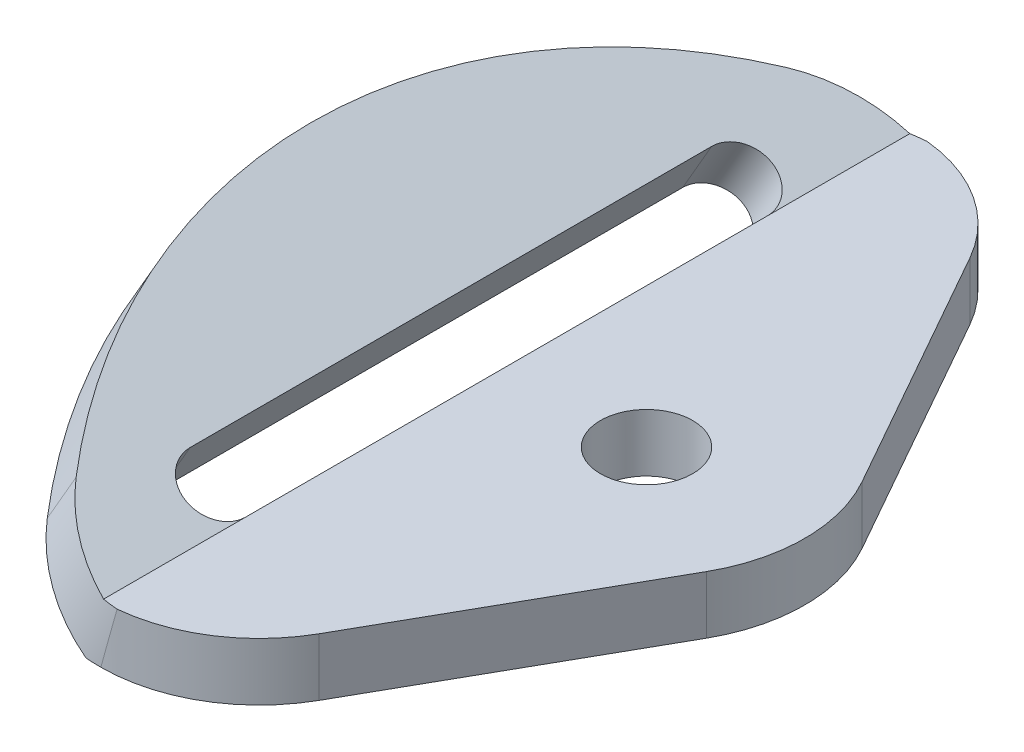
ISO-10303-21;
HEADER;
FILE_DESCRIPTION(('STEP AP214'),'2;1');
FILE_NAME('part.step','',(''),(''),'','','');
FILE_SCHEMA(('AUTOMOTIVE_DESIGN { 1 0 10303 214 1 1 1 1 }'));
ENDSEC;
DATA;
#1=APPLICATION_CONTEXT('core data for automotive mechanical design processes');
#2=APPLICATION_PROTOCOL_DEFINITION('international standard','automotive_design',2000,#1);
#3=PRODUCT_CONTEXT('',#1,'mechanical');
#4=PRODUCT('Part','Part','',(#3));
#5=PRODUCT_RELATED_PRODUCT_CATEGORY('part','',(#4));
#6=PRODUCT_DEFINITION_FORMATION('','',#4);
#7=PRODUCT_DEFINITION_CONTEXT('part definition',#1,'design');
#8=PRODUCT_DEFINITION('design','',#6,#7);
#9=PRODUCT_DEFINITION_SHAPE('','',#8);
#10=(LENGTH_UNIT() NAMED_UNIT(*) SI_UNIT(.MILLI.,.METRE.));
#11=(NAMED_UNIT(*) PLANE_ANGLE_UNIT() SI_UNIT($,.RADIAN.));
#12=(NAMED_UNIT(*) SI_UNIT($,.STERADIAN.) SOLID_ANGLE_UNIT());
#13=UNCERTAINTY_MEASURE_WITH_UNIT(LENGTH_MEASURE(1.E-05),#10,'distance_accuracy_value','');
#14=(GEOMETRIC_REPRESENTATION_CONTEXT(3) GLOBAL_UNCERTAINTY_ASSIGNED_CONTEXT((#13)) GLOBAL_UNIT_ASSIGNED_CONTEXT((#10,
#11,#12)) REPRESENTATION_CONTEXT('',''));
#15=CARTESIAN_POINT('',(0.,0.,0.));
#16=DIRECTION('',(0.,0.,1.));
#17=DIRECTION('',(1.,0.,0.));
#18=AXIS2_PLACEMENT_3D('',#15,#16,#17);
#19=CARTESIAN_POINT('',(0.,0.,35.179));
#20=DIRECTION('',(0.499999999999995,0.866025403784442,0.));
#21=DIRECTION('',(-0.866025403784442,0.499999999999995,0.));
#22=AXIS2_PLACEMENT_3D('',#19,#20,#21);
#23=PLANE('',#22);
#24=DIRECTION('',(0.,0.,-1.));
#25=VECTOR('',#24,1.);
#26=CARTESIAN_POINT('',(-6.00048578726058,3.46438208454337,22.606));
#27=LINE('',#26,#25);
#28=CARTESIAN_POINT('',(-6.00048578726058,3.46438208454337,22.606));
#29=VERTEX_POINT('',#28);
#30=CARTESIAN_POINT('',(-6.00048578726058,3.46438208454337,-22.606));
#31=VERTEX_POINT('',#30);
#32=EDGE_CURVE('E197',#29,#31,#27,.T.);
#33=ORIENTED_EDGE('',*,*,#32,.F.);
#34=CARTESIAN_POINT('',(-3.58081080908685,2.06738208454339,22.606));
#35=DIRECTION('',(-0.499999999999995,-0.866025403784442,0.));
#36=DIRECTION('',(0.866025403784442,-0.499999999999995,0.));
#37=AXIS2_PLACEMENT_3D('',#34,#35,#36);
#38=CIRCLE('',#37,2.794);
#39=CARTESIAN_POINT('',(-1.16113583091312,0.670382084543401,22.606));
#40=VERTEX_POINT('',#39);
#41=EDGE_CURVE('E62',#40,#29,#38,.T.);
#42=ORIENTED_EDGE('',*,*,#41,.F.);
#43=DIRECTION('',(0.,0.,1.));
#44=VECTOR('',#43,1.);
#45=CARTESIAN_POINT('',(-1.16113583091312,0.670382084543401,22.606));
#46=LINE('',#45,#44);
#47=CARTESIAN_POINT('',(-1.16113583091312,0.670382084543401,-22.606));
#48=VERTEX_POINT('',#47);
#49=EDGE_CURVE('E205',#48,#40,#46,.T.);
#50=ORIENTED_EDGE('',*,*,#49,.F.);
#51=CARTESIAN_POINT('',(-3.58081080908685,2.06738208454339,-22.606));
#52=DIRECTION('',(-0.499999999999995,-0.866025403784442,0.));
#53=DIRECTION('',(0.866025403784442,-0.499999999999995,0.));
#54=AXIS2_PLACEMENT_3D('',#51,#52,#53);
#55=CIRCLE('',#54,2.794);
#56=EDGE_CURVE('E201',#31,#48,#55,.T.);
#57=ORIENTED_EDGE('',*,*,#56,.F.);
#58=EDGE_LOOP('',(#33,#42,#50,#57));
#59=FACE_BOUND('',#58,.T.);
#60=CARTESIAN_POINT('',(1.00557312681514,-0.580567915456566,21.463));
#61=DIRECTION('',(0.499999999999995,0.866025403784442,0.));
#62=DIRECTION('',(0.866025403784442,-0.499999999999995,0.));
#63=AXIS2_PLACEMENT_3D('',#60,#61,#62);
#64=CIRCLE('',#63,13.716);
#65=CARTESIAN_POINT('',(-7.71721540588537,4.45553639198218,30.7731702249951));
#66=VERTEX_POINT('',#65);
#67=CARTESIAN_POINT('',(0.,0.,35.1297633177051));
#68=VERTEX_POINT('',#67);
#69=EDGE_CURVE('E139',#66,#68,#64,.T.);
#70=ORIENTED_EDGE('',*,*,#69,.F.);
#71=CARTESIAN_POINT('',(21.1144654191093,-12.1904422935176,0.));
#72=DIRECTION('',(0.499999999999995,0.866025403784442,0.));
#73=DIRECTION('',(0.866025403784442,-0.499999999999995,0.));
#74=AXIS2_PLACEMENT_3D('',#71,#72,#73);
#75=CIRCLE('',#74,45.3358845870355);
#76=CARTESIAN_POINT('',(-7.71721540588537,4.45553639198218,-30.7731702249951));
#77=VERTEX_POINT('',#76);
#78=EDGE_CURVE('E167',#77,#66,#75,.T.);
#79=ORIENTED_EDGE('',*,*,#78,.F.);
#80=CARTESIAN_POINT('',(1.00557312681514,-0.580567915456566,-21.463));
#81=DIRECTION('',(0.499999999999995,0.866025403784442,0.));
#82=DIRECTION('',(0.866025403784442,-0.499999999999995,0.));
#83=AXIS2_PLACEMENT_3D('',#80,#81,#82);
#84=CIRCLE('',#83,13.716);
#85=CARTESIAN_POINT('',(0.,0.,-35.1297633177051));
#86=VERTEX_POINT('',#85);
#87=EDGE_CURVE('E166',#86,#77,#84,.T.);
#88=ORIENTED_EDGE('',*,*,#87,.F.);
#89=DIRECTION('',(0.,0.,-1.));
#90=VECTOR('',#89,1.);
#91=CARTESIAN_POINT('',(0.,0.,35.179));
#92=LINE('',#91,#90);
#93=EDGE_CURVE('E11',#68,#86,#92,.T.);
#94=ORIENTED_EDGE('',*,*,#93,.F.);
#95=EDGE_LOOP('',(#70,#79,#88,#94));
#96=FACE_BOUND('',#95,.T.);
#97=ADVANCED_FACE('F39',(#59,#96),#23,.F.);
#98=CARTESIAN_POINT('',(0.,0.,35.179));
#99=DIRECTION('',(0.,1.,0.));
#100=DIRECTION('',(0.,0.,1.));
#101=AXIS2_PLACEMENT_3D('',#98,#99,#100);
#102=PLANE('',#101);
#103=CARTESIAN_POINT('',(13.462,0.,0.));
#104=DIRECTION('',(0.,-1.,0.));
#105=DIRECTION('',(0.,0.,-1.));
#106=AXIS2_PLACEMENT_3D('',#103,#104,#105);
#107=CIRCLE('',#106,4.);
#108=CARTESIAN_POINT('',(13.462,0.,-4.));
#109=VERTEX_POINT('',#108);
#110=EDGE_CURVE('E272',#109,#109,#107,.T.);
#111=ORIENTED_EDGE('',*,*,#110,.F.);
#112=EDGE_LOOP('',(#111));
#113=FACE_BOUND('',#112,.T.);
#114=CARTESIAN_POINT('',(1.34076416908684,0.,21.463));
#115=DIRECTION('',(0.,1.,0.));
#116=DIRECTION('',(0.,0.,-1.));
#117=AXIS2_PLACEMENT_3D('',#114,#115,#116);
#118=CIRCLE('',#117,13.716);
#119=CARTESIAN_POINT('',(1.34076416908683,0.,35.179));
#120=VERTEX_POINT('',#119);
#121=CARTESIAN_POINT('',(13.2837929201756,0.,28.2078291491088));
#122=VERTEX_POINT('',#121);
#123=EDGE_CURVE('E160',#120,#122,#118,.T.);
#124=ORIENTED_EDGE('',*,*,#123,.F.);
#125=CARTESIAN_POINT('',(1.34076416908684,0.,21.463));
#126=DIRECTION('',(0.,1.,0.));
#127=DIRECTION('',(-1.,0.,0.));
#128=AXIS2_PLACEMENT_3D('',#125,#126,#127);
#129=ELLIPSE('',#128,15.8378725844098,13.716);
#130=EDGE_CURVE('E143',#68,#120,#129,.T.);
#131=ORIENTED_EDGE('',*,*,#130,.F.);
#132=ORIENTED_EDGE('',*,*,#93,.T.);
#133=CARTESIAN_POINT('',(1.34076416908684,0.,-21.463));
#134=DIRECTION('',(0.,1.,0.));
#135=DIRECTION('',(-1.,0.,0.));
#136=AXIS2_PLACEMENT_3D('',#133,#134,#135);
#137=ELLIPSE('',#136,15.8378725844098,13.716);
#138=CARTESIAN_POINT('',(1.34076416908684,0.,-35.179));
#139=VERTEX_POINT('',#138);
#140=EDGE_CURVE('E162',#139,#86,#137,.T.);
#141=ORIENTED_EDGE('',*,*,#140,.F.);
#142=CARTESIAN_POINT('',(1.34076416908684,0.,-21.463));
#143=DIRECTION('',(0.,1.,0.));
#144=DIRECTION('',(0.,0.,-1.));
#145=AXIS2_PLACEMENT_3D('',#142,#143,#144);
#146=CIRCLE('',#145,13.716);
#147=CARTESIAN_POINT('',(13.2837929201756,0.,-28.2078291491088));
#148=VERTEX_POINT('',#147);
#149=EDGE_CURVE('E256',#148,#139,#146,.T.);
#150=ORIENTED_EDGE('',*,*,#149,.F.);
#151=DIRECTION('',(-0.491748990165414,0.,-0.870737004308014));
#152=VECTOR('',#151,1.);
#153=CARTESIAN_POINT('',(13.2837929201756,0.,-28.2078291491088));
#154=LINE('',#153,#152);
#155=CARTESIAN_POINT('',(25.4050287510887,0.,-6.74482914910882));
#156=VERTEX_POINT('',#155);
#157=EDGE_CURVE('E264',#156,#148,#154,.T.);
#158=ORIENTED_EDGE('',*,*,#157,.F.);
#159=CARTESIAN_POINT('',(13.462,0.,0.));
#160=DIRECTION('',(0.,1.,0.));
#161=DIRECTION('',(0.,0.,-1.));
#162=AXIS2_PLACEMENT_3D('',#159,#160,#161);
#163=CIRCLE('',#162,13.716);
#164=CARTESIAN_POINT('',(25.4050287510887,0.,6.74482914910882));
#165=VERTEX_POINT('',#164);
#166=EDGE_CURVE('E260',#165,#156,#163,.T.);
#167=ORIENTED_EDGE('',*,*,#166,.F.);
#168=DIRECTION('',(0.491748990165414,0.,-0.870737004308014));
#169=VECTOR('',#168,1.);
#170=CARTESIAN_POINT('',(13.2837929201756,0.,28.2078291491088));
#171=LINE('',#170,#169);
#172=EDGE_CURVE('E236',#122,#165,#171,.T.);
#173=ORIENTED_EDGE('',*,*,#172,.F.);
#174=EDGE_LOOP('',(#124,#131,#132,#141,#150,#158,#167,#173));
#175=FACE_BOUND('',#174,.T.);
#176=ADVANCED_FACE('F155',(#113,#175),#102,.F.);
#177=CARTESIAN_POINT('',(27.178,5.0038,35.179));
#178=DIRECTION('',(0.,-1.,0.));
#179=DIRECTION('',(1.,0.,0.));
#180=AXIS2_PLACEMENT_3D('',#177,#178,#179);
#181=PLANE('',#180);
#182=CARTESIAN_POINT('',(13.462,5.0038,0.));
#183=DIRECTION('',(0.,-1.,0.));
#184=DIRECTION('',(1.,0.,0.));
#185=AXIS2_PLACEMENT_3D('',#182,#183,#184);
#186=CIRCLE('',#185,4.);
#187=CARTESIAN_POINT('',(17.462,5.0038,0.));
#188=VERTEX_POINT('',#187);
#189=EDGE_CURVE('E278',#188,#188,#186,.F.);
#190=ORIENTED_EDGE('',*,*,#189,.F.);
#191=EDGE_LOOP('',(#190));
#192=FACE_BOUND('',#191,.T.);
#193=DIRECTION('',(0.,0.,-1.));
#194=VECTOR('',#193,1.);
#195=CARTESIAN_POINT('',(1.34076416908684,5.0038,35.179));
#196=LINE('',#195,#194);
#197=CARTESIAN_POINT('',(1.34076416908684,5.0038,34.9488871562089));
#198=VERTEX_POINT('',#197);
#199=CARTESIAN_POINT('',(1.34076416908685,5.00379999999998,22.606));
#200=VERTEX_POINT('',#199);
#201=EDGE_CURVE('E47',#198,#200,#196,.T.);
#202=ORIENTED_EDGE('',*,*,#201,.F.);
#203=CARTESIAN_POINT('',(4.22970944605785,5.00379999999999,21.463));
#204=DIRECTION('',(0.,-1.,0.));
#205=DIRECTION('',(-1.,0.,0.));
#206=AXIS2_PLACEMENT_3D('',#203,#204,#205);
#207=ELLIPSE('',#206,15.8378725844098,13.716);
#208=CARTESIAN_POINT('',(2.68152833817368,5.0038,35.1133116243877));
#209=VERTEX_POINT('',#208);
#210=EDGE_CURVE('E151',#209,#198,#207,.T.);
#211=ORIENTED_EDGE('',*,*,#210,.F.);
#212=CARTESIAN_POINT('',(1.34076416908684,5.0038,21.463));
#213=DIRECTION('',(0.,-1.,0.));
#214=DIRECTION('',(1.,0.,0.));
#215=AXIS2_PLACEMENT_3D('',#212,#213,#214);
#216=CIRCLE('',#215,13.716);
#217=CARTESIAN_POINT('',(13.2837929201756,5.0038,28.2078291491088));
#218=VERTEX_POINT('',#217);
#219=EDGE_CURVE('E226',#218,#209,#216,.T.);
#220=ORIENTED_EDGE('',*,*,#219,.F.);
#221=DIRECTION('',(-0.491748990165414,0.,0.870737004308015));
#222=VECTOR('',#221,1.);
#223=CARTESIAN_POINT('',(13.2837929201756,5.0038,28.2078291491088));
#224=LINE('',#223,#222);
#225=CARTESIAN_POINT('',(25.4050287510887,5.0038,6.74482914910882));
#226=VERTEX_POINT('',#225);
#227=EDGE_CURVE('E225',#226,#218,#224,.T.);
#228=ORIENTED_EDGE('',*,*,#227,.F.);
#229=CARTESIAN_POINT('',(13.462,5.0038,0.));
#230=DIRECTION('',(0.,-1.,0.));
#231=DIRECTION('',(1.,0.,0.));
#232=AXIS2_PLACEMENT_3D('',#229,#230,#231);
#233=CIRCLE('',#232,13.716);
#234=CARTESIAN_POINT('',(25.4050287510887,5.0038,-6.74482914910882));
#235=VERTEX_POINT('',#234);
#236=EDGE_CURVE('E241',#235,#226,#233,.T.);
#237=ORIENTED_EDGE('',*,*,#236,.F.);
#238=DIRECTION('',(0.491748990165414,0.,0.870737004308014));
#239=VECTOR('',#238,1.);
#240=CARTESIAN_POINT('',(13.2837929201756,5.0038,-28.2078291491088));
#241=LINE('',#240,#239);
#242=CARTESIAN_POINT('',(13.2837929201756,5.0038,-28.2078291491088));
#243=VERTEX_POINT('',#242);
#244=EDGE_CURVE('E249',#243,#235,#241,.T.);
#245=ORIENTED_EDGE('',*,*,#244,.F.);
#246=CARTESIAN_POINT('',(1.34076416908684,5.0038,-21.463));
#247=DIRECTION('',(0.,-1.,0.));
#248=DIRECTION('',(1.,0.,0.));
#249=AXIS2_PLACEMENT_3D('',#246,#247,#248);
#250=CIRCLE('',#249,13.716);
#251=CARTESIAN_POINT('',(2.68152833817368,5.0038,-35.1133116243877));
#252=VERTEX_POINT('',#251);
#253=EDGE_CURVE('E253',#252,#243,#250,.T.);
#254=ORIENTED_EDGE('',*,*,#253,.F.);
#255=CARTESIAN_POINT('',(4.22970944605785,5.00379999999999,-21.463));
#256=DIRECTION('',(0.,-1.,0.));
#257=DIRECTION('',(-1.,0.,0.));
#258=AXIS2_PLACEMENT_3D('',#255,#256,#257);
#259=ELLIPSE('',#258,15.8378725844098,13.716);
#260=CARTESIAN_POINT('',(1.34076416908684,5.0038,-34.9488871562089));
#261=VERTEX_POINT('',#260);
#262=EDGE_CURVE('E54',#261,#252,#259,.T.);
#263=ORIENTED_EDGE('',*,*,#262,.F.);
#264=CARTESIAN_POINT('',(1.34076416908685,5.00379999999999,-22.606));
#265=VERTEX_POINT('',#264);
#266=EDGE_CURVE('E281',#265,#261,#196,.T.);
#267=ORIENTED_EDGE('',*,*,#266,.F.);
#268=DIRECTION('',(0.,0.,-1.));
#269=VECTOR('',#268,1.);
#270=CARTESIAN_POINT('',(1.34076416908684,5.0038,35.179));
#271=LINE('',#270,#269);
#272=EDGE_CURVE('E184',#200,#265,#271,.T.);
#273=ORIENTED_EDGE('',*,*,#272,.F.);
#274=EDGE_LOOP('',(#202,#211,#220,#228,#237,#245,#254,#263,#267,#273));
#275=FACE_BOUND('',#274,.T.);
#276=ADVANCED_FACE('F298',(#192,#275),#181,.F.);
#277=CARTESIAN_POINT('',(-15.645662336303,14.8109179154565,35.179));
#278=DIRECTION('',(-0.499999999999995,-0.866025403784442,0.));
#279=DIRECTION('',(0.866025403784442,-0.499999999999995,0.));
#280=AXIS2_PLACEMENT_3D('',#277,#278,#279);
#281=PLANE('',#280);
#282=CARTESIAN_POINT('',(23.6163654191093,-7.85702437806106,0.));
#283=DIRECTION('',(-0.499999999999995,-0.866025403784442,0.));
#284=DIRECTION('',(0.866025403784442,-0.499999999999995,0.));
#285=AXIS2_PLACEMENT_3D('',#282,#283,#284);
#286=CIRCLE('',#285,45.3358845870355);
#287=CARTESIAN_POINT('',(-5.21531540588539,8.78895430743877,30.7731702249951));
#288=VERTEX_POINT('',#287);
#289=CARTESIAN_POINT('',(-5.2153154058854,8.78895430743877,-30.7731702249951));
#290=VERTEX_POINT('',#289);
#291=EDGE_CURVE('E180',#288,#290,#286,.T.);
#292=ORIENTED_EDGE('',*,*,#291,.F.);
#293=CARTESIAN_POINT('',(3.50747312681511,3.75285000000002,21.463));
#294=DIRECTION('',(-0.499999999999995,-0.866025403784442,0.));
#295=DIRECTION('',(0.866025403784442,-0.499999999999995,0.));
#296=AXIS2_PLACEMENT_3D('',#293,#294,#295);
#297=CIRCLE('',#296,13.716);
#298=EDGE_CURVE('E312',#198,#288,#297,.T.);
#299=ORIENTED_EDGE('',*,*,#298,.F.);
#300=ORIENTED_EDGE('',*,*,#201,.T.);
#301=CARTESIAN_POINT('',(-1.07891080908688,6.40079999999997,22.606));
#302=DIRECTION('',(-0.499999999999995,-0.866025403784442,0.));
#303=DIRECTION('',(0.866025403784442,-0.499999999999995,0.));
#304=AXIS2_PLACEMENT_3D('',#301,#302,#303);
#305=CIRCLE('',#304,2.794);
#306=CARTESIAN_POINT('',(-3.49858578726061,7.79779999999996,22.606));
#307=VERTEX_POINT('',#306);
#308=EDGE_CURVE('E191',#307,#200,#305,.F.);
#309=ORIENTED_EDGE('',*,*,#308,.F.);
#310=DIRECTION('',(0.,0.,1.));
#311=VECTOR('',#310,1.);
#312=CARTESIAN_POINT('',(-3.49858578726061,7.79779999999996,22.606));
#313=LINE('',#312,#311);
#314=CARTESIAN_POINT('',(-3.49858578726061,7.79779999999996,-22.606));
#315=VERTEX_POINT('',#314);
#316=EDGE_CURVE('E213',#315,#307,#313,.T.);
#317=ORIENTED_EDGE('',*,*,#316,.F.);
#318=CARTESIAN_POINT('',(-1.07891080908688,6.40079999999997,-22.606));
#319=DIRECTION('',(-0.499999999999995,-0.866025403784442,0.));
#320=DIRECTION('',(0.866025403784442,-0.499999999999995,0.));
#321=AXIS2_PLACEMENT_3D('',#318,#319,#320);
#322=CIRCLE('',#321,2.794);
#323=EDGE_CURVE('E188',#265,#315,#322,.F.);
#324=ORIENTED_EDGE('',*,*,#323,.F.);
#325=ORIENTED_EDGE('',*,*,#266,.T.);
#326=CARTESIAN_POINT('',(3.50747312681511,3.75285000000002,-21.463));
#327=DIRECTION('',(-0.499999999999995,-0.866025403784442,0.));
#328=DIRECTION('',(0.866025403784442,-0.499999999999995,0.));
#329=AXIS2_PLACEMENT_3D('',#326,#327,#328);
#330=CIRCLE('',#329,13.716);
#331=EDGE_CURVE('E294',#290,#261,#330,.T.);
#332=ORIENTED_EDGE('',*,*,#331,.F.);
#333=EDGE_LOOP('',(#292,#299,#300,#309,#317,#324,#325,#332));
#334=FACE_BOUND('',#333,.T.);
#335=ADVANCED_FACE('F293',(#334),#281,.F.);
#336=CARTESIAN_POINT('',(13.462,14.8119179154565,0.));
#337=DIRECTION('',(0.,-1.,0.));
#338=DIRECTION('',(0.,0.,-1.));
#339=AXIS2_PLACEMENT_3D('',#336,#337,#338);
#340=CYLINDRICAL_SURFACE('',#339,4.);
#341=ORIENTED_EDGE('',*,*,#110,.T.);
#342=EDGE_LOOP('',(#341));
#343=FACE_BOUND('',#342,.T.);
#344=ORIENTED_EDGE('',*,*,#189,.T.);
#345=EDGE_LOOP('',(#344));
#346=FACE_BOUND('',#345,.T.);
#347=ADVANCED_FACE('F379',(#343,#346),#340,.F.);
#348=CARTESIAN_POINT('',(13.462,14.8119179154565,0.));
#349=DIRECTION('',(0.,-1.,0.));
#350=DIRECTION('',(0.,0.,-1.));
#351=AXIS2_PLACEMENT_3D('',#348,#349,#350);
#352=CYLINDRICAL_SURFACE('',#351,13.716);
#353=ORIENTED_EDGE('',*,*,#236,.T.);
#354=DIRECTION('',(0.,-1.,0.));
#355=VECTOR('',#354,1.);
#356=CARTESIAN_POINT('',(25.4050287510887,14.8119179154565,6.74482914910882));
#357=LINE('',#356,#355);
#358=EDGE_CURVE('E230',#226,#165,#357,.T.);
#359=ORIENTED_EDGE('',*,*,#358,.T.);
#360=ORIENTED_EDGE('',*,*,#166,.T.);
#361=DIRECTION('',(0.,-1.,0.));
#362=VECTOR('',#361,1.);
#363=CARTESIAN_POINT('',(25.4050287510887,14.8119179154565,-6.74482914910882));
#364=LINE('',#363,#362);
#365=EDGE_CURVE('E268',#235,#156,#364,.T.);
#366=ORIENTED_EDGE('',*,*,#365,.F.);
#367=EDGE_LOOP('',(#353,#359,#360,#366));
#368=FACE_BOUND('',#367,.T.);
#369=ADVANCED_FACE('F326',(#368),#352,.T.);
#370=CARTESIAN_POINT('',(13.2837929201756,14.8119179154565,-28.2078291491088));
#371=DIRECTION('',(-0.870737004308014,0.,0.491748990165414));
#372=DIRECTION('',(0.491748990165414,0.,0.870737004308014));
#373=AXIS2_PLACEMENT_3D('',#370,#371,#372);
#374=PLANE('',#373);
#375=ORIENTED_EDGE('',*,*,#244,.T.);
#376=ORIENTED_EDGE('',*,*,#365,.T.);
#377=ORIENTED_EDGE('',*,*,#157,.T.);
#378=DIRECTION('',(0.,-1.,0.));
#379=VECTOR('',#378,1.);
#380=CARTESIAN_POINT('',(13.2837929201756,14.8119179154565,-28.2078291491088));
#381=LINE('',#380,#379);
#382=EDGE_CURVE('E269',#243,#148,#381,.T.);
#383=ORIENTED_EDGE('',*,*,#382,.F.);
#384=EDGE_LOOP('',(#375,#376,#377,#383));
#385=FACE_BOUND('',#384,.T.);
#386=ADVANCED_FACE('F330',(#385),#374,.F.);
#387=CARTESIAN_POINT('',(1.34076416908684,14.8119179154565,-21.463));
#388=DIRECTION('',(0.,-1.,0.));
#389=DIRECTION('',(0.,0.,-1.));
#390=AXIS2_PLACEMENT_3D('',#387,#388,#389);
#391=CYLINDRICAL_SURFACE('',#390,13.716);
#392=ORIENTED_EDGE('',*,*,#149,.T.);
#393=CARTESIAN_POINT('',(1.34076416908684,0.,-21.463));
#394=DIRECTION('',(-0.965925826289069,0.258819045102518,0.));
#395=DIRECTION('',(-0.258819045102518,-0.965925826289069,0.));
#396=AXIS2_PLACEMENT_3D('',#393,#394,#395);
#397=ELLIPSE('',#396,52.994554533524,13.716);
#398=EDGE_CURVE('E169',#252,#139,#397,.T.);
#399=ORIENTED_EDGE('',*,*,#398,.F.);
#400=ORIENTED_EDGE('',*,*,#253,.T.);
#401=ORIENTED_EDGE('',*,*,#382,.T.);
#402=EDGE_LOOP('',(#392,#399,#400,#401));
#403=FACE_BOUND('',#402,.T.);
#404=ADVANCED_FACE('F333',(#403),#391,.T.);
#405=CARTESIAN_POINT('',(13.2837929201756,14.8119179154565,28.2078291491088));
#406=DIRECTION('',(-0.870737004308014,0.,-0.491748990165414));
#407=DIRECTION('',(-0.491748990165414,0.,0.870737004308015));
#408=AXIS2_PLACEMENT_3D('',#405,#406,#407);
#409=PLANE('',#408);
#410=ORIENTED_EDGE('',*,*,#227,.T.);
#411=DIRECTION('',(0.,-1.,0.));
#412=VECTOR('',#411,1.);
#413=CARTESIAN_POINT('',(13.2837929201756,14.8119179154565,28.2078291491088));
#414=LINE('',#413,#412);
#415=EDGE_CURVE('E237',#218,#122,#414,.T.);
#416=ORIENTED_EDGE('',*,*,#415,.T.);
#417=ORIENTED_EDGE('',*,*,#172,.T.);
#418=ORIENTED_EDGE('',*,*,#358,.F.);
#419=EDGE_LOOP('',(#410,#416,#417,#418));
#420=FACE_BOUND('',#419,.T.);
#421=ADVANCED_FACE('F323',(#420),#409,.F.);
#422=CARTESIAN_POINT('',(1.34076416908684,14.8119179154565,21.463));
#423=DIRECTION('',(0.,-1.,0.));
#424=DIRECTION('',(0.,0.,-1.));
#425=AXIS2_PLACEMENT_3D('',#422,#423,#424);
#426=CYLINDRICAL_SURFACE('',#425,13.716);
#427=ORIENTED_EDGE('',*,*,#219,.T.);
#428=CARTESIAN_POINT('',(1.34076416908684,0.,21.463));
#429=DIRECTION('',(-0.965925826289069,0.258819045102518,0.));
#430=DIRECTION('',(-0.258819045102518,-0.965925826289069,0.));
#431=AXIS2_PLACEMENT_3D('',#428,#429,#430);
#432=ELLIPSE('',#431,52.994554533524,13.716);
#433=EDGE_CURVE('E309',#120,#209,#432,.T.);
#434=ORIENTED_EDGE('',*,*,#433,.F.);
#435=ORIENTED_EDGE('',*,*,#123,.T.);
#436=ORIENTED_EDGE('',*,*,#415,.F.);
#437=EDGE_LOOP('',(#427,#434,#435,#436));
#438=FACE_BOUND('',#437,.T.);
#439=ADVANCED_FACE('F320',(#438),#426,.T.);
#440=CARTESIAN_POINT('',(9.62768778769054,24.9451727458644,22.606));
#441=DIRECTION('',(-0.499999999999995,-0.866025403784442,0.));
#442=DIRECTION('',(0.866025403784442,-0.499999999999995,0.));
#443=AXIS2_PLACEMENT_3D('',#440,#441,#442);
#444=CYLINDRICAL_SURFACE('',#443,2.794);
#445=ORIENTED_EDGE('',*,*,#308,.T.);
#446=DIRECTION('',(-0.499999999999995,-0.866025403784442,0.));
#447=VECTOR('',#446,1.);
#448=CARTESIAN_POINT('',(12.0473627658643,23.5481727458644,22.606));
#449=LINE('',#448,#447);
#450=EDGE_CURVE('E210',#200,#40,#449,.T.);
#451=ORIENTED_EDGE('',*,*,#450,.T.);
#452=ORIENTED_EDGE('',*,*,#41,.T.);
#453=DIRECTION('',(-0.499999999999995,-0.866025403784442,0.));
#454=VECTOR('',#453,1.);
#455=CARTESIAN_POINT('',(7.20801280951681,26.3421727458644,22.606));
#456=LINE('',#455,#454);
#457=EDGE_CURVE('E209',#307,#29,#456,.T.);
#458=ORIENTED_EDGE('',*,*,#457,.F.);
#459=EDGE_LOOP('',(#445,#451,#452,#458));
#460=FACE_BOUND('',#459,.T.);
#461=ADVANCED_FACE('F359',(#460),#444,.F.);
#462=CARTESIAN_POINT('',(12.0473627658643,23.5481727458644,22.606));
#463=DIRECTION('',(0.866025403784442,-0.499999999999995,0.));
#464=DIRECTION('',(0.499999999999995,0.866025403784442,0.));
#465=AXIS2_PLACEMENT_3D('',#462,#463,#464);
#466=PLANE('',#465);
#467=ORIENTED_EDGE('',*,*,#272,.T.);
#468=DIRECTION('',(-0.499999999999995,-0.866025403784442,0.));
#469=VECTOR('',#468,1.);
#470=CARTESIAN_POINT('',(12.0473627658643,23.5481727458644,-22.606));
#471=LINE('',#470,#469);
#472=EDGE_CURVE('E214',#265,#48,#471,.T.);
#473=ORIENTED_EDGE('',*,*,#472,.T.);
#474=ORIENTED_EDGE('',*,*,#49,.T.);
#475=ORIENTED_EDGE('',*,*,#450,.F.);
#476=EDGE_LOOP('',(#467,#473,#474,#475));
#477=FACE_BOUND('',#476,.T.);
#478=ADVANCED_FACE('F361',(#477),#466,.F.);
#479=CARTESIAN_POINT('',(9.62768778769054,24.9451727458644,-22.606));
#480=DIRECTION('',(-0.499999999999995,-0.866025403784442,0.));
#481=DIRECTION('',(0.866025403784442,-0.499999999999995,0.));
#482=AXIS2_PLACEMENT_3D('',#479,#480,#481);
#483=CYLINDRICAL_SURFACE('',#482,2.794);
#484=ORIENTED_EDGE('',*,*,#323,.T.);
#485=DIRECTION('',(-0.499999999999995,-0.866025403784442,0.));
#486=VECTOR('',#485,1.);
#487=CARTESIAN_POINT('',(7.20801280951681,26.3421727458644,-22.606));
#488=LINE('',#487,#486);
#489=EDGE_CURVE('E217',#315,#31,#488,.T.);
#490=ORIENTED_EDGE('',*,*,#489,.T.);
#491=ORIENTED_EDGE('',*,*,#56,.T.);
#492=ORIENTED_EDGE('',*,*,#472,.F.);
#493=EDGE_LOOP('',(#484,#490,#491,#492));
#494=FACE_BOUND('',#493,.T.);
#495=ADVANCED_FACE('F345',(#494),#483,.F.);
#496=CARTESIAN_POINT('',(7.20801280951681,26.3421727458644,22.606));
#497=DIRECTION('',(-0.866025403784442,0.499999999999995,0.));
#498=DIRECTION('',(-0.499999999999995,-0.866025403784442,0.));
#499=AXIS2_PLACEMENT_3D('',#496,#497,#498);
#500=PLANE('',#499);
#501=ORIENTED_EDGE('',*,*,#316,.T.);
#502=ORIENTED_EDGE('',*,*,#457,.T.);
#503=ORIENTED_EDGE('',*,*,#32,.T.);
#504=ORIENTED_EDGE('',*,*,#489,.F.);
#505=EDGE_LOOP('',(#501,#502,#503,#504));
#506=FACE_BOUND('',#505,.T.);
#507=ADVANCED_FACE('F337',(#506),#500,.F.);
#508=CARTESIAN_POINT('',(14.2140717235925,22.2972227458644,-21.463));
#509=DIRECTION('',(-0.499999999999995,-0.866025403784442,0.));
#510=DIRECTION('',(0.866025403784442,-0.499999999999995,0.));
#511=AXIS2_PLACEMENT_3D('',#508,#509,#510);
#512=CYLINDRICAL_SURFACE('',#511,13.716);
#513=ORIENTED_EDGE('',*,*,#331,.T.);
#514=ORIENTED_EDGE('',*,*,#262,.T.);
#515=ORIENTED_EDGE('',*,*,#398,.T.);
#516=ORIENTED_EDGE('',*,*,#140,.T.);
#517=ORIENTED_EDGE('',*,*,#87,.T.);
#518=DIRECTION('',(-0.499999999999995,-0.866025403784442,0.));
#519=VECTOR('',#518,1.);
#520=CARTESIAN_POINT('',(5.49128319089202,27.3333270533032,-30.7731702249951));
#521=LINE('',#520,#519);
#522=EDGE_CURVE('E173',#290,#77,#521,.T.);
#523=ORIENTED_EDGE('',*,*,#522,.F.);
#524=EDGE_LOOP('',(#513,#514,#515,#516,#517,#523));
#525=FACE_BOUND('',#524,.T.);
#526=ADVANCED_FACE('F334',(#525),#512,.T.);
#527=CARTESIAN_POINT('',(34.3229640158867,10.6873483678033,0.));
#528=DIRECTION('',(-0.499999999999995,-0.866025403784442,0.));
#529=DIRECTION('',(0.866025403784442,-0.499999999999995,0.));
#530=AXIS2_PLACEMENT_3D('',#527,#528,#529);
#531=CYLINDRICAL_SURFACE('',#530,45.3358845870355);
#532=ORIENTED_EDGE('',*,*,#291,.T.);
#533=ORIENTED_EDGE('',*,*,#522,.T.);
#534=ORIENTED_EDGE('',*,*,#78,.T.);
#535=DIRECTION('',(-0.499999999999995,-0.866025403784442,0.));
#536=VECTOR('',#535,1.);
#537=CARTESIAN_POINT('',(5.49128319089202,27.3333270533032,30.7731702249951));
#538=LINE('',#537,#536);
#539=EDGE_CURVE('E146',#288,#66,#538,.T.);
#540=ORIENTED_EDGE('',*,*,#539,.F.);
#541=EDGE_LOOP('',(#532,#533,#534,#540));
#542=FACE_BOUND('',#541,.T.);
#543=ADVANCED_FACE('F336',(#542),#531,.T.);
#544=CARTESIAN_POINT('',(14.2140717235925,22.2972227458644,21.463));
#545=DIRECTION('',(-0.499999999999995,-0.866025403784442,0.));
#546=DIRECTION('',(0.866025403784442,-0.499999999999995,0.));
#547=AXIS2_PLACEMENT_3D('',#544,#545,#546);
#548=CYLINDRICAL_SURFACE('',#547,13.716);
#549=ORIENTED_EDGE('',*,*,#298,.T.);
#550=ORIENTED_EDGE('',*,*,#539,.T.);
#551=ORIENTED_EDGE('',*,*,#69,.T.);
#552=ORIENTED_EDGE('',*,*,#130,.T.);
#553=ORIENTED_EDGE('',*,*,#433,.T.);
#554=ORIENTED_EDGE('',*,*,#210,.T.);
#555=EDGE_LOOP('',(#549,#550,#551,#552,#553,#554));
#556=FACE_BOUND('',#555,.T.);
#557=ADVANCED_FACE('F142',(#556),#548,.T.);
#558=CLOSED_SHELL('',(#97,#176,#276,#335,#347,#369,#386,#404,#421,#439,#461,#478,#495,#507,#526,
#543,#557));
#559=MANIFOLD_SOLID_BREP('B2',#558);
#560=ADVANCED_BREP_SHAPE_REPRESENTATION('',(#18,#559),#14);
#561=SHAPE_DEFINITION_REPRESENTATION(#9,#560);
ENDSEC;
END-ISO-10303-21;
